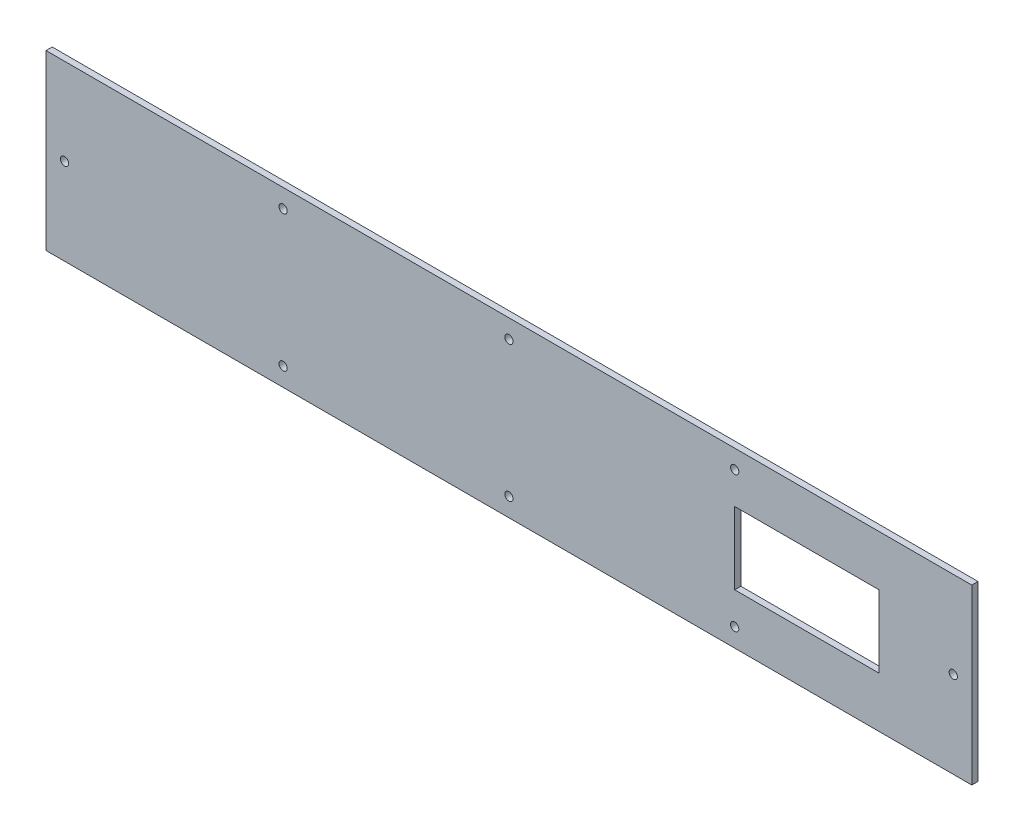
ISO-10303-21;
HEADER;
FILE_DESCRIPTION(('STEP AP214'),'2;1');
FILE_NAME('part.step','',(''),(''),'','','');
FILE_SCHEMA(('AUTOMOTIVE_DESIGN { 1 0 10303 214 1 1 1 1 }'));
ENDSEC;
DATA;
#1=APPLICATION_CONTEXT('core data for automotive mechanical design processes');
#2=APPLICATION_PROTOCOL_DEFINITION('international standard','automotive_design',2000,#1);
#3=PRODUCT_CONTEXT('',#1,'mechanical');
#4=PRODUCT('Part','Part','',(#3));
#5=PRODUCT_RELATED_PRODUCT_CATEGORY('part','',(#4));
#6=PRODUCT_DEFINITION_FORMATION('','',#4);
#7=PRODUCT_DEFINITION_CONTEXT('part definition',#1,'design');
#8=PRODUCT_DEFINITION('design','',#6,#7);
#9=PRODUCT_DEFINITION_SHAPE('','',#8);
#10=(LENGTH_UNIT() NAMED_UNIT(*) SI_UNIT(.MILLI.,.METRE.));
#11=(NAMED_UNIT(*) PLANE_ANGLE_UNIT() SI_UNIT($,.RADIAN.));
#12=(NAMED_UNIT(*) SI_UNIT($,.STERADIAN.) SOLID_ANGLE_UNIT());
#13=UNCERTAINTY_MEASURE_WITH_UNIT(LENGTH_MEASURE(1.E-05),#10,'distance_accuracy_value','');
#14=(GEOMETRIC_REPRESENTATION_CONTEXT(3) GLOBAL_UNCERTAINTY_ASSIGNED_CONTEXT((#13)) GLOBAL_UNIT_ASSIGNED_CONTEXT((#10,
#11,#12)) REPRESENTATION_CONTEXT('',''));
#15=CARTESIAN_POINT('',(0.,0.,0.));
#16=DIRECTION('',(0.,0.,1.));
#17=DIRECTION('',(1.,0.,0.));
#18=AXIS2_PLACEMENT_3D('',#15,#16,#17);
#19=CARTESIAN_POINT('',(0.,0.,3.));
#20=DIRECTION('',(0.,0.,-1.));
#21=DIRECTION('',(-1.,0.,0.));
#22=AXIS2_PLACEMENT_3D('',#19,#20,#21);
#23=PLANE('',#22);
#24=CARTESIAN_POINT('',(115.,8.99999999999306,3.));
#25=DIRECTION('',(0.,0.,1.));
#26=DIRECTION('',(-1.,0.,0.));
#27=AXIS2_PLACEMENT_3D('',#24,#25,#26);
#28=CIRCLE('',#27,2.);
#29=CARTESIAN_POINT('',(113.,8.99999999999306,3.));
#30=VERTEX_POINT('',#29);
#31=EDGE_CURVE('E260',#30,#30,#28,.T.);
#32=ORIENTED_EDGE('',*,*,#31,.F.);
#33=EDGE_LOOP('',(#32));
#34=FACE_BOUND('',#33,.T.);
#35=CARTESIAN_POINT('',(334.,74.9999999999943,3.));
#36=DIRECTION('',(0.,0.,1.));
#37=DIRECTION('',(1.,0.,0.));
#38=AXIS2_PLACEMENT_3D('',#35,#36,#37);
#39=CIRCLE('',#38,2.);
#40=CARTESIAN_POINT('',(336.,74.9999999999943,3.));
#41=VERTEX_POINT('',#40);
#42=EDGE_CURVE('E129',#41,#41,#39,.T.);
#43=ORIENTED_EDGE('',*,*,#42,.F.);
#44=EDGE_LOOP('',(#43));
#45=FACE_BOUND('',#44,.T.);
#46=CARTESIAN_POINT('',(440.,42.,3.));
#47=DIRECTION('',(0.,0.,1.));
#48=DIRECTION('',(1.,0.,0.));
#49=AXIS2_PLACEMENT_3D('',#46,#47,#48);
#50=CIRCLE('',#49,2.);
#51=CARTESIAN_POINT('',(442.,42.,3.));
#52=VERTEX_POINT('',#51);
#53=EDGE_CURVE('E139',#52,#52,#50,.T.);
#54=ORIENTED_EDGE('',*,*,#53,.F.);
#55=EDGE_LOOP('',(#54));
#56=FACE_BOUND('',#55,.T.);
#57=CARTESIAN_POINT('',(224.5,75.,3.));
#58=DIRECTION('',(0.,0.,1.));
#59=DIRECTION('',(1.,0.,0.));
#60=AXIS2_PLACEMENT_3D('',#57,#58,#59);
#61=CIRCLE('',#60,2.);
#62=CARTESIAN_POINT('',(226.5,75.,3.));
#63=VERTEX_POINT('',#62);
#64=EDGE_CURVE('E151',#63,#63,#61,.T.);
#65=ORIENTED_EDGE('',*,*,#64,.F.);
#66=EDGE_LOOP('',(#65));
#67=FACE_BOUND('',#66,.T.);
#68=DIRECTION('',(1.,0.,0.));
#69=VECTOR('',#68,1.);
#70=CARTESIAN_POINT('',(449.,0.,3.));
#71=LINE('',#70,#69);
#72=CARTESIAN_POINT('',(0.,0.,3.));
#73=VERTEX_POINT('',#72);
#74=CARTESIAN_POINT('',(449.,0.,3.));
#75=VERTEX_POINT('',#74);
#76=EDGE_CURVE('E163',#73,#75,#71,.T.);
#77=ORIENTED_EDGE('',*,*,#76,.T.);
#78=DIRECTION('',(0.,1.,0.));
#79=VECTOR('',#78,1.);
#80=CARTESIAN_POINT('',(449.,84.,3.));
#81=LINE('',#80,#79);
#82=CARTESIAN_POINT('',(449.,84.,3.));
#83=VERTEX_POINT('',#82);
#84=EDGE_CURVE('E166',#75,#83,#81,.T.);
#85=ORIENTED_EDGE('',*,*,#84,.T.);
#86=DIRECTION('',(-1.,0.,0.));
#87=VECTOR('',#86,1.);
#88=CARTESIAN_POINT('',(0.,84.,3.));
#89=LINE('',#88,#87);
#90=CARTESIAN_POINT('',(0.,84.,3.));
#91=VERTEX_POINT('',#90);
#92=EDGE_CURVE('E169',#83,#91,#89,.T.);
#93=ORIENTED_EDGE('',*,*,#92,.T.);
#94=DIRECTION('',(0.,-1.,0.));
#95=VECTOR('',#94,1.);
#96=CARTESIAN_POINT('',(0.,0.,3.));
#97=LINE('',#96,#95);
#98=EDGE_CURVE('E171',#91,#73,#97,.T.);
#99=ORIENTED_EDGE('',*,*,#98,.T.);
#100=EDGE_LOOP('',(#77,#85,#93,#99));
#101=FACE_BOUND('',#100,.T.);
#102=CARTESIAN_POINT('',(9.,42.,3.));
#103=DIRECTION('',(0.,0.,1.));
#104=DIRECTION('',(1.,0.,0.));
#105=AXIS2_PLACEMENT_3D('',#102,#103,#104);
#106=CIRCLE('',#105,2.);
#107=CARTESIAN_POINT('',(11.,42.,3.));
#108=VERTEX_POINT('',#107);
#109=EDGE_CURVE('E157',#108,#108,#106,.T.);
#110=ORIENTED_EDGE('',*,*,#109,.F.);
#111=EDGE_LOOP('',(#110));
#112=FACE_BOUND('',#111,.T.);
#113=CARTESIAN_POINT('',(224.5,8.99999999999999,3.));
#114=DIRECTION('',(0.,0.,1.));
#115=DIRECTION('',(1.,0.,0.));
#116=AXIS2_PLACEMENT_3D('',#113,#114,#115);
#117=CIRCLE('',#116,2.);
#118=CARTESIAN_POINT('',(226.5,8.99999999999999,3.));
#119=VERTEX_POINT('',#118);
#120=EDGE_CURVE('E145',#119,#119,#117,.T.);
#121=ORIENTED_EDGE('',*,*,#120,.F.);
#122=EDGE_LOOP('',(#121));
#123=FACE_BOUND('',#122,.T.);
#124=DIRECTION('',(-1.,0.,0.));
#125=VECTOR('',#124,1.);
#126=CARTESIAN_POINT('',(404.,59.5,3.));
#127=LINE('',#126,#125);
#128=CARTESIAN_POINT('',(404.,59.5,3.));
#129=VERTEX_POINT('',#128);
#130=CARTESIAN_POINT('',(334.,59.5,3.));
#131=VERTEX_POINT('',#130);
#132=EDGE_CURVE('E100',#129,#131,#127,.T.);
#133=ORIENTED_EDGE('',*,*,#132,.F.);
#134=DIRECTION('',(0.,1.,0.));
#135=VECTOR('',#134,1.);
#136=CARTESIAN_POINT('',(404.,24.5,3.));
#137=LINE('',#136,#135);
#138=CARTESIAN_POINT('',(404.,24.5,3.));
#139=VERTEX_POINT('',#138);
#140=EDGE_CURVE('E123',#139,#129,#137,.T.);
#141=ORIENTED_EDGE('',*,*,#140,.F.);
#142=DIRECTION('',(1.,0.,0.));
#143=VECTOR('',#142,1.);
#144=CARTESIAN_POINT('',(334.,24.5,3.));
#145=LINE('',#144,#143);
#146=CARTESIAN_POINT('',(334.,24.5,3.));
#147=VERTEX_POINT('',#146);
#148=EDGE_CURVE('E121',#147,#139,#145,.T.);
#149=ORIENTED_EDGE('',*,*,#148,.F.);
#150=DIRECTION('',(0.,-1.,0.));
#151=VECTOR('',#150,1.);
#152=CARTESIAN_POINT('',(334.,59.5,3.));
#153=LINE('',#152,#151);
#154=EDGE_CURVE('E108',#131,#147,#153,.T.);
#155=ORIENTED_EDGE('',*,*,#154,.F.);
#156=EDGE_LOOP('',(#133,#141,#149,#155));
#157=FACE_BOUND('',#156,.T.);
#158=CARTESIAN_POINT('',(334.,8.99999999999306,3.));
#159=DIRECTION('',(0.,0.,1.));
#160=DIRECTION('',(1.,0.,0.));
#161=AXIS2_PLACEMENT_3D('',#158,#159,#160);
#162=CIRCLE('',#161,2.);
#163=CARTESIAN_POINT('',(336.,8.99999999999306,3.));
#164=VERTEX_POINT('',#163);
#165=EDGE_CURVE('E265',#164,#164,#162,.T.);
#166=ORIENTED_EDGE('',*,*,#165,.F.);
#167=EDGE_LOOP('',(#166));
#168=FACE_BOUND('',#167,.T.);
#169=CARTESIAN_POINT('',(115.,74.9999999999943,3.));
#170=DIRECTION('',(0.,0.,1.));
#171=DIRECTION('',(-1.,0.,0.));
#172=AXIS2_PLACEMENT_3D('',#169,#170,#171);
#173=CIRCLE('',#172,2.);
#174=CARTESIAN_POINT('',(113.,74.9999999999943,3.));
#175=VERTEX_POINT('',#174);
#176=EDGE_CURVE('E254',#175,#175,#173,.T.);
#177=ORIENTED_EDGE('',*,*,#176,.F.);
#178=EDGE_LOOP('',(#177));
#179=FACE_BOUND('',#178,.T.);
#180=ADVANCED_FACE('F35',(#34,#45,#56,#67,#101,#112,#123,#157,#168,#179),#23,.F.);
#181=CARTESIAN_POINT('',(0.,0.,0.));
#182=DIRECTION('',(0.,0.,-1.));
#183=DIRECTION('',(-1.,0.,0.));
#184=AXIS2_PLACEMENT_3D('',#181,#182,#183);
#185=PLANE('',#184);
#186=CARTESIAN_POINT('',(115.,8.99999999999306,0.));
#187=DIRECTION('',(0.,0.,1.));
#188=DIRECTION('',(-1.,0.,0.));
#189=AXIS2_PLACEMENT_3D('',#186,#187,#188);
#190=CIRCLE('',#189,2.);
#191=CARTESIAN_POINT('',(113.,8.99999999999306,0.));
#192=VERTEX_POINT('',#191);
#193=EDGE_CURVE('E257',#192,#192,#190,.T.);
#194=ORIENTED_EDGE('',*,*,#193,.T.);
#195=EDGE_LOOP('',(#194));
#196=FACE_BOUND('',#195,.T.);
#197=CARTESIAN_POINT('',(334.,74.9999999999943,0.));
#198=DIRECTION('',(0.,0.,1.));
#199=DIRECTION('',(1.,0.,0.));
#200=AXIS2_PLACEMENT_3D('',#197,#198,#199);
#201=CIRCLE('',#200,2.);
#202=CARTESIAN_POINT('',(336.,74.9999999999943,0.));
#203=VERTEX_POINT('',#202);
#204=EDGE_CURVE('E268',#203,#203,#201,.T.);
#205=ORIENTED_EDGE('',*,*,#204,.T.);
#206=EDGE_LOOP('',(#205));
#207=FACE_BOUND('',#206,.T.);
#208=CARTESIAN_POINT('',(440.,42.,0.));
#209=DIRECTION('',(0.,0.,1.));
#210=DIRECTION('',(1.,0.,0.));
#211=AXIS2_PLACEMENT_3D('',#208,#209,#210);
#212=CIRCLE('',#211,2.);
#213=CARTESIAN_POINT('',(442.,42.,0.));
#214=VERTEX_POINT('',#213);
#215=EDGE_CURVE('E116',#214,#214,#212,.T.);
#216=ORIENTED_EDGE('',*,*,#215,.T.);
#217=EDGE_LOOP('',(#216));
#218=FACE_BOUND('',#217,.T.);
#219=CARTESIAN_POINT('',(224.5,75.,0.));
#220=DIRECTION('',(0.,0.,1.));
#221=DIRECTION('',(1.,0.,0.));
#222=AXIS2_PLACEMENT_3D('',#219,#220,#221);
#223=CIRCLE('',#222,2.);
#224=CARTESIAN_POINT('',(226.5,75.,0.));
#225=VERTEX_POINT('',#224);
#226=EDGE_CURVE('E148',#225,#225,#223,.T.);
#227=ORIENTED_EDGE('',*,*,#226,.T.);
#228=EDGE_LOOP('',(#227));
#229=FACE_BOUND('',#228,.T.);
#230=DIRECTION('',(1.,0.,0.));
#231=VECTOR('',#230,1.);
#232=CARTESIAN_POINT('',(449.,0.,0.));
#233=LINE('',#232,#231);
#234=CARTESIAN_POINT('',(0.,0.,0.));
#235=VERTEX_POINT('',#234);
#236=CARTESIAN_POINT('',(449.,0.,0.));
#237=VERTEX_POINT('',#236);
#238=EDGE_CURVE('E160',#235,#237,#233,.T.);
#239=ORIENTED_EDGE('',*,*,#238,.F.);
#240=DIRECTION('',(0.,-1.,0.));
#241=VECTOR('',#240,1.);
#242=CARTESIAN_POINT('',(0.,0.,0.));
#243=LINE('',#242,#241);
#244=CARTESIAN_POINT('',(0.,84.,0.));
#245=VERTEX_POINT('',#244);
#246=EDGE_CURVE('E167',#245,#235,#243,.T.);
#247=ORIENTED_EDGE('',*,*,#246,.F.);
#248=DIRECTION('',(-1.,0.,0.));
#249=VECTOR('',#248,1.);
#250=CARTESIAN_POINT('',(0.,84.,0.));
#251=LINE('',#250,#249);
#252=CARTESIAN_POINT('',(449.,84.,0.));
#253=VERTEX_POINT('',#252);
#254=EDGE_CURVE('E178',#253,#245,#251,.T.);
#255=ORIENTED_EDGE('',*,*,#254,.F.);
#256=DIRECTION('',(0.,1.,0.));
#257=VECTOR('',#256,1.);
#258=CARTESIAN_POINT('',(449.,84.,0.));
#259=LINE('',#258,#257);
#260=EDGE_CURVE('E176',#237,#253,#259,.T.);
#261=ORIENTED_EDGE('',*,*,#260,.F.);
#262=EDGE_LOOP('',(#239,#247,#255,#261));
#263=FACE_BOUND('',#262,.T.);
#264=CARTESIAN_POINT('',(9.,42.,0.));
#265=DIRECTION('',(0.,0.,1.));
#266=DIRECTION('',(1.,0.,0.));
#267=AXIS2_PLACEMENT_3D('',#264,#265,#266);
#268=CIRCLE('',#267,2.);
#269=CARTESIAN_POINT('',(11.,42.,0.));
#270=VERTEX_POINT('',#269);
#271=EDGE_CURVE('E154',#270,#270,#268,.T.);
#272=ORIENTED_EDGE('',*,*,#271,.T.);
#273=EDGE_LOOP('',(#272));
#274=FACE_BOUND('',#273,.T.);
#275=CARTESIAN_POINT('',(224.5,8.99999999999999,0.));
#276=DIRECTION('',(0.,0.,1.));
#277=DIRECTION('',(1.,0.,0.));
#278=AXIS2_PLACEMENT_3D('',#275,#276,#277);
#279=CIRCLE('',#278,2.);
#280=CARTESIAN_POINT('',(226.5,8.99999999999999,0.));
#281=VERTEX_POINT('',#280);
#282=EDGE_CURVE('E142',#281,#281,#279,.T.);
#283=ORIENTED_EDGE('',*,*,#282,.T.);
#284=EDGE_LOOP('',(#283));
#285=FACE_BOUND('',#284,.T.);
#286=DIRECTION('',(0.,1.,0.));
#287=VECTOR('',#286,1.);
#288=CARTESIAN_POINT('',(404.,24.5,0.));
#289=LINE('',#288,#287);
#290=CARTESIAN_POINT('',(404.,24.5,0.));
#291=VERTEX_POINT('',#290);
#292=CARTESIAN_POINT('',(404.,59.5,0.));
#293=VERTEX_POINT('',#292);
#294=EDGE_CURVE('E109',#291,#293,#289,.T.);
#295=ORIENTED_EDGE('',*,*,#294,.T.);
#296=DIRECTION('',(-1.,0.,0.));
#297=VECTOR('',#296,1.);
#298=CARTESIAN_POINT('',(404.,59.5,0.));
#299=LINE('',#298,#297);
#300=CARTESIAN_POINT('',(334.,59.5,0.));
#301=VERTEX_POINT('',#300);
#302=EDGE_CURVE('E58',#293,#301,#299,.T.);
#303=ORIENTED_EDGE('',*,*,#302,.T.);
#304=DIRECTION('',(0.,-1.,0.));
#305=VECTOR('',#304,1.);
#306=CARTESIAN_POINT('',(334.,59.5,0.));
#307=LINE('',#306,#305);
#308=CARTESIAN_POINT('',(334.,24.5,0.));
#309=VERTEX_POINT('',#308);
#310=EDGE_CURVE('E115',#301,#309,#307,.T.);
#311=ORIENTED_EDGE('',*,*,#310,.T.);
#312=DIRECTION('',(1.,0.,0.));
#313=VECTOR('',#312,1.);
#314=CARTESIAN_POINT('',(334.,24.5,0.));
#315=LINE('',#314,#313);
#316=EDGE_CURVE('E131',#309,#291,#315,.T.);
#317=ORIENTED_EDGE('',*,*,#316,.T.);
#318=EDGE_LOOP('',(#295,#303,#311,#317));
#319=FACE_BOUND('',#318,.T.);
#320=CARTESIAN_POINT('',(334.,8.99999999999306,0.));
#321=DIRECTION('',(0.,0.,1.));
#322=DIRECTION('',(1.,0.,0.));
#323=AXIS2_PLACEMENT_3D('',#320,#321,#322);
#324=CIRCLE('',#323,2.);
#325=CARTESIAN_POINT('',(336.,8.99999999999306,0.));
#326=VERTEX_POINT('',#325);
#327=EDGE_CURVE('E249',#326,#326,#324,.T.);
#328=ORIENTED_EDGE('',*,*,#327,.T.);
#329=EDGE_LOOP('',(#328));
#330=FACE_BOUND('',#329,.T.);
#331=CARTESIAN_POINT('',(115.,74.9999999999943,0.));
#332=DIRECTION('',(0.,0.,1.));
#333=DIRECTION('',(-1.,0.,0.));
#334=AXIS2_PLACEMENT_3D('',#331,#332,#333);
#335=CIRCLE('',#334,2.);
#336=CARTESIAN_POINT('',(113.,74.9999999999943,0.));
#337=VERTEX_POINT('',#336);
#338=EDGE_CURVE('E252',#337,#337,#335,.T.);
#339=ORIENTED_EDGE('',*,*,#338,.T.);
#340=EDGE_LOOP('',(#339));
#341=FACE_BOUND('',#340,.T.);
#342=ADVANCED_FACE('F196',(#196,#207,#218,#229,#263,#274,#285,#319,#330,#341),#185,.T.);
#343=CARTESIAN_POINT('',(449.,0.,3.));
#344=DIRECTION('',(0.,1.,0.));
#345=DIRECTION('',(-1.,0.,0.));
#346=AXIS2_PLACEMENT_3D('',#343,#344,#345);
#347=PLANE('',#346);
#348=ORIENTED_EDGE('',*,*,#238,.T.);
#349=DIRECTION('',(0.,0.,-1.));
#350=VECTOR('',#349,1.);
#351=CARTESIAN_POINT('',(449.,0.,3.));
#352=LINE('',#351,#350);
#353=EDGE_CURVE('E11',#75,#237,#352,.T.);
#354=ORIENTED_EDGE('',*,*,#353,.F.);
#355=ORIENTED_EDGE('',*,*,#76,.F.);
#356=DIRECTION('',(0.,0.,-1.));
#357=VECTOR('',#356,1.);
#358=CARTESIAN_POINT('',(0.,0.,3.));
#359=LINE('',#358,#357);
#360=EDGE_CURVE('E173',#73,#235,#359,.T.);
#361=ORIENTED_EDGE('',*,*,#360,.T.);
#362=EDGE_LOOP('',(#348,#354,#355,#361));
#363=FACE_BOUND('',#362,.T.);
#364=ADVANCED_FACE('F37',(#363),#347,.F.);
#365=CARTESIAN_POINT('',(449.,84.,3.));
#366=DIRECTION('',(-1.,0.,0.));
#367=DIRECTION('',(0.,0.,1.));
#368=AXIS2_PLACEMENT_3D('',#365,#366,#367);
#369=PLANE('',#368);
#370=ORIENTED_EDGE('',*,*,#260,.T.);
#371=DIRECTION('',(0.,0.,-1.));
#372=VECTOR('',#371,1.);
#373=CARTESIAN_POINT('',(449.,84.,3.));
#374=LINE('',#373,#372);
#375=EDGE_CURVE('E43',#83,#253,#374,.T.);
#376=ORIENTED_EDGE('',*,*,#375,.F.);
#377=ORIENTED_EDGE('',*,*,#84,.F.);
#378=ORIENTED_EDGE('',*,*,#353,.T.);
#379=EDGE_LOOP('',(#370,#376,#377,#378));
#380=FACE_BOUND('',#379,.T.);
#381=ADVANCED_FACE('F207',(#380),#369,.F.);
#382=CARTESIAN_POINT('',(0.,84.,3.));
#383=DIRECTION('',(0.,-1.,0.));
#384=DIRECTION('',(0.,0.,-1.));
#385=AXIS2_PLACEMENT_3D('',#382,#383,#384);
#386=PLANE('',#385);
#387=ORIENTED_EDGE('',*,*,#254,.T.);
#388=DIRECTION('',(0.,0.,-1.));
#389=VECTOR('',#388,1.);
#390=CARTESIAN_POINT('',(0.,84.,3.));
#391=LINE('',#390,#389);
#392=EDGE_CURVE('E183',#91,#245,#391,.T.);
#393=ORIENTED_EDGE('',*,*,#392,.F.);
#394=ORIENTED_EDGE('',*,*,#92,.F.);
#395=ORIENTED_EDGE('',*,*,#375,.T.);
#396=EDGE_LOOP('',(#387,#393,#394,#395));
#397=FACE_BOUND('',#396,.T.);
#398=ADVANCED_FACE('F190',(#397),#386,.F.);
#399=CARTESIAN_POINT('',(0.,0.,3.));
#400=DIRECTION('',(1.,0.,0.));
#401=DIRECTION('',(0.,0.,-1.));
#402=AXIS2_PLACEMENT_3D('',#399,#400,#401);
#403=PLANE('',#402);
#404=ORIENTED_EDGE('',*,*,#246,.T.);
#405=ORIENTED_EDGE('',*,*,#360,.F.);
#406=ORIENTED_EDGE('',*,*,#98,.F.);
#407=ORIENTED_EDGE('',*,*,#392,.T.);
#408=EDGE_LOOP('',(#404,#405,#406,#407));
#409=FACE_BOUND('',#408,.T.);
#410=ADVANCED_FACE('F200',(#409),#403,.F.);
#411=CARTESIAN_POINT('',(9.,42.,3.));
#412=DIRECTION('',(0.,0.,-1.));
#413=DIRECTION('',(-1.,0.,0.));
#414=AXIS2_PLACEMENT_3D('',#411,#412,#413);
#415=CYLINDRICAL_SURFACE('',#414,2.);
#416=ORIENTED_EDGE('',*,*,#109,.T.);
#417=EDGE_LOOP('',(#416));
#418=FACE_BOUND('',#417,.T.);
#419=ORIENTED_EDGE('',*,*,#271,.F.);
#420=EDGE_LOOP('',(#419));
#421=FACE_BOUND('',#420,.T.);
#422=ADVANCED_FACE('F225',(#418,#421),#415,.F.);
#423=CARTESIAN_POINT('',(224.5,75.,3.));
#424=DIRECTION('',(0.,0.,-1.));
#425=DIRECTION('',(-1.,0.,0.));
#426=AXIS2_PLACEMENT_3D('',#423,#424,#425);
#427=CYLINDRICAL_SURFACE('',#426,2.);
#428=ORIENTED_EDGE('',*,*,#64,.T.);
#429=EDGE_LOOP('',(#428));
#430=FACE_BOUND('',#429,.T.);
#431=ORIENTED_EDGE('',*,*,#226,.F.);
#432=EDGE_LOOP('',(#431));
#433=FACE_BOUND('',#432,.T.);
#434=ADVANCED_FACE('F232',(#430,#433),#427,.F.);
#435=CARTESIAN_POINT('',(224.5,8.99999999999999,3.));
#436=DIRECTION('',(0.,0.,-1.));
#437=DIRECTION('',(-1.,0.,0.));
#438=AXIS2_PLACEMENT_3D('',#435,#436,#437);
#439=CYLINDRICAL_SURFACE('',#438,2.);
#440=ORIENTED_EDGE('',*,*,#120,.T.);
#441=EDGE_LOOP('',(#440));
#442=FACE_BOUND('',#441,.T.);
#443=ORIENTED_EDGE('',*,*,#282,.F.);
#444=EDGE_LOOP('',(#443));
#445=FACE_BOUND('',#444,.T.);
#446=ADVANCED_FACE('F237',(#442,#445),#439,.F.);
#447=CARTESIAN_POINT('',(440.,42.,3.));
#448=DIRECTION('',(0.,0.,-1.));
#449=DIRECTION('',(-1.,0.,0.));
#450=AXIS2_PLACEMENT_3D('',#447,#448,#449);
#451=CYLINDRICAL_SURFACE('',#450,2.);
#452=ORIENTED_EDGE('',*,*,#53,.T.);
#453=EDGE_LOOP('',(#452));
#454=FACE_BOUND('',#453,.T.);
#455=ORIENTED_EDGE('',*,*,#215,.F.);
#456=EDGE_LOOP('',(#455));
#457=FACE_BOUND('',#456,.T.);
#458=ADVANCED_FACE('F300',(#454,#457),#451,.F.);
#459=CARTESIAN_POINT('',(404.,59.5,3.));
#460=DIRECTION('',(0.,-1.,0.));
#461=DIRECTION('',(0.,0.,-1.));
#462=AXIS2_PLACEMENT_3D('',#459,#460,#461);
#463=PLANE('',#462);
#464=ORIENTED_EDGE('',*,*,#302,.F.);
#465=DIRECTION('',(0.,0.,-1.));
#466=VECTOR('',#465,1.);
#467=CARTESIAN_POINT('',(404.,59.5,3.));
#468=LINE('',#467,#466);
#469=EDGE_CURVE('E104',#129,#293,#468,.T.);
#470=ORIENTED_EDGE('',*,*,#469,.F.);
#471=ORIENTED_EDGE('',*,*,#132,.T.);
#472=DIRECTION('',(0.,0.,-1.));
#473=VECTOR('',#472,1.);
#474=CARTESIAN_POINT('',(334.,59.5,3.));
#475=LINE('',#474,#473);
#476=EDGE_CURVE('E103',#131,#301,#475,.T.);
#477=ORIENTED_EDGE('',*,*,#476,.T.);
#478=EDGE_LOOP('',(#464,#470,#471,#477));
#479=FACE_BOUND('',#478,.T.);
#480=ADVANCED_FACE('F102',(#479),#463,.T.);
#481=CARTESIAN_POINT('',(334.,59.5,3.));
#482=DIRECTION('',(1.,0.,0.));
#483=DIRECTION('',(0.,0.,-1.));
#484=AXIS2_PLACEMENT_3D('',#481,#482,#483);
#485=PLANE('',#484);
#486=ORIENTED_EDGE('',*,*,#310,.F.);
#487=ORIENTED_EDGE('',*,*,#476,.F.);
#488=ORIENTED_EDGE('',*,*,#154,.T.);
#489=DIRECTION('',(0.,0.,-1.));
#490=VECTOR('',#489,1.);
#491=CARTESIAN_POINT('',(334.,24.5,3.));
#492=LINE('',#491,#490);
#493=EDGE_CURVE('E117',#147,#309,#492,.T.);
#494=ORIENTED_EDGE('',*,*,#493,.T.);
#495=EDGE_LOOP('',(#486,#487,#488,#494));
#496=FACE_BOUND('',#495,.T.);
#497=ADVANCED_FACE('F112',(#496),#485,.T.);
#498=CARTESIAN_POINT('',(334.,24.5,3.));
#499=DIRECTION('',(0.,1.,0.));
#500=DIRECTION('',(0.,0.,1.));
#501=AXIS2_PLACEMENT_3D('',#498,#499,#500);
#502=PLANE('',#501);
#503=ORIENTED_EDGE('',*,*,#316,.F.);
#504=ORIENTED_EDGE('',*,*,#493,.F.);
#505=ORIENTED_EDGE('',*,*,#148,.T.);
#506=DIRECTION('',(0.,0.,-1.));
#507=VECTOR('',#506,1.);
#508=CARTESIAN_POINT('',(404.,24.5,3.));
#509=LINE('',#508,#507);
#510=EDGE_CURVE('E50',#139,#291,#509,.T.);
#511=ORIENTED_EDGE('',*,*,#510,.T.);
#512=EDGE_LOOP('',(#503,#504,#505,#511));
#513=FACE_BOUND('',#512,.T.);
#514=ADVANCED_FACE('F289',(#513),#502,.T.);
#515=CARTESIAN_POINT('',(404.,24.5,3.));
#516=DIRECTION('',(-1.,0.,0.));
#517=DIRECTION('',(0.,0.,1.));
#518=AXIS2_PLACEMENT_3D('',#515,#516,#517);
#519=PLANE('',#518);
#520=ORIENTED_EDGE('',*,*,#294,.F.);
#521=ORIENTED_EDGE('',*,*,#510,.F.);
#522=ORIENTED_EDGE('',*,*,#140,.T.);
#523=ORIENTED_EDGE('',*,*,#469,.T.);
#524=EDGE_LOOP('',(#520,#521,#522,#523));
#525=FACE_BOUND('',#524,.T.);
#526=ADVANCED_FACE('F279',(#525),#519,.T.);
#527=CARTESIAN_POINT('',(334.,74.9999999999943,3.));
#528=DIRECTION('',(0.,0.,-1.));
#529=DIRECTION('',(-1.,0.,0.));
#530=AXIS2_PLACEMENT_3D('',#527,#528,#529);
#531=CYLINDRICAL_SURFACE('',#530,2.);
#532=ORIENTED_EDGE('',*,*,#42,.T.);
#533=EDGE_LOOP('',(#532));
#534=FACE_BOUND('',#533,.T.);
#535=ORIENTED_EDGE('',*,*,#204,.F.);
#536=EDGE_LOOP('',(#535));
#537=FACE_BOUND('',#536,.T.);
#538=ADVANCED_FACE('F276',(#534,#537),#531,.F.);
#539=CARTESIAN_POINT('',(334.,8.99999999999306,3.));
#540=DIRECTION('',(0.,0.,-1.));
#541=DIRECTION('',(-1.,0.,0.));
#542=AXIS2_PLACEMENT_3D('',#539,#540,#541);
#543=CYLINDRICAL_SURFACE('',#542,2.);
#544=ORIENTED_EDGE('',*,*,#165,.T.);
#545=EDGE_LOOP('',(#544));
#546=FACE_BOUND('',#545,.T.);
#547=ORIENTED_EDGE('',*,*,#327,.F.);
#548=EDGE_LOOP('',(#547));
#549=FACE_BOUND('',#548,.T.);
#550=ADVANCED_FACE('F278',(#546,#549),#543,.F.);
#551=CARTESIAN_POINT('',(115.,8.99999999999306,3.));
#552=DIRECTION('',(0.,0.,-1.));
#553=DIRECTION('',(-1.,0.,0.));
#554=AXIS2_PLACEMENT_3D('',#551,#552,#553);
#555=CYLINDRICAL_SURFACE('',#554,2.);
#556=ORIENTED_EDGE('',*,*,#31,.T.);
#557=EDGE_LOOP('',(#556));
#558=FACE_BOUND('',#557,.T.);
#559=ORIENTED_EDGE('',*,*,#193,.F.);
#560=EDGE_LOOP('',(#559));
#561=FACE_BOUND('',#560,.T.);
#562=ADVANCED_FACE('F286',(#558,#561),#555,.F.);
#563=CARTESIAN_POINT('',(115.,74.9999999999943,3.));
#564=DIRECTION('',(0.,0.,-1.));
#565=DIRECTION('',(-1.,0.,0.));
#566=AXIS2_PLACEMENT_3D('',#563,#564,#565);
#567=CYLINDRICAL_SURFACE('',#566,2.);
#568=ORIENTED_EDGE('',*,*,#176,.T.);
#569=EDGE_LOOP('',(#568));
#570=FACE_BOUND('',#569,.T.);
#571=ORIENTED_EDGE('',*,*,#338,.F.);
#572=EDGE_LOOP('',(#571));
#573=FACE_BOUND('',#572,.T.);
#574=ADVANCED_FACE('F352',(#570,#573),#567,.F.);
#575=CLOSED_SHELL('',(#180,#342,#364,#381,#398,#410,#422,#434,#446,#458,#480,#497,#514,#526,
#538,#550,#562,#574));
#576=MANIFOLD_SOLID_BREP('B2',#575);
#577=ADVANCED_BREP_SHAPE_REPRESENTATION('',(#18,#576),#14);
#578=SHAPE_DEFINITION_REPRESENTATION(#9,#577);
ENDSEC;
END-ISO-10303-21;
